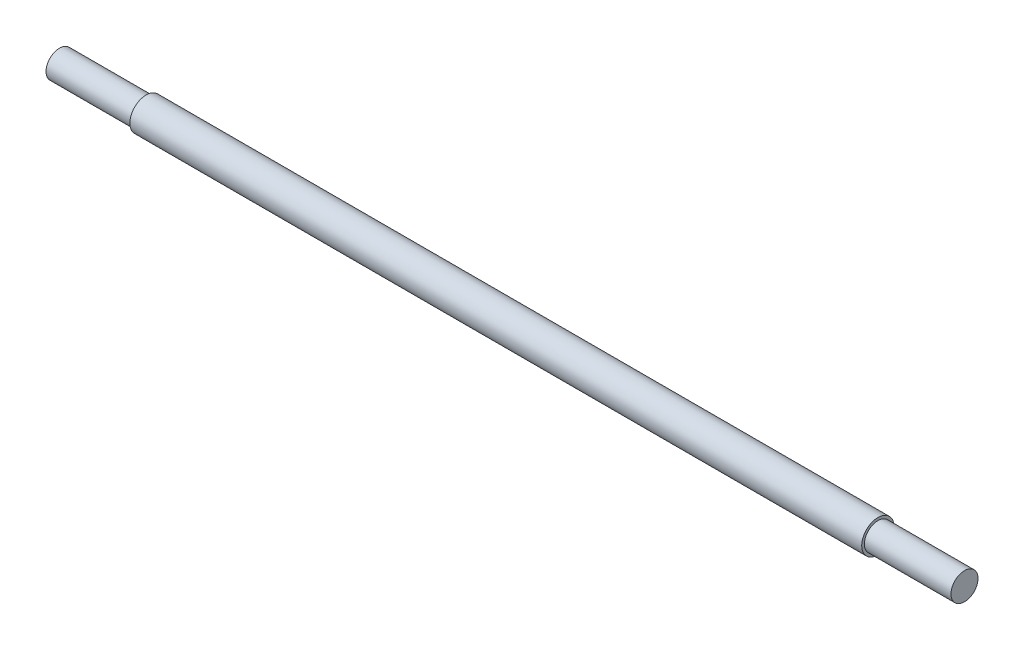
ISO-10303-21;
HEADER;
FILE_DESCRIPTION(('STEP AP214'),'2;1');
FILE_NAME('part.step','',(''),(''),'','','');
FILE_SCHEMA(('AUTOMOTIVE_DESIGN { 1 0 10303 214 1 1 1 1 }'));
ENDSEC;
DATA;
#1=APPLICATION_CONTEXT('core data for automotive mechanical design processes');
#2=APPLICATION_PROTOCOL_DEFINITION('international standard','automotive_design',2000,#1);
#3=PRODUCT_CONTEXT('',#1,'mechanical');
#4=PRODUCT('Part','Part','',(#3));
#5=PRODUCT_RELATED_PRODUCT_CATEGORY('part','',(#4));
#6=PRODUCT_DEFINITION_FORMATION('','',#4);
#7=PRODUCT_DEFINITION_CONTEXT('part definition',#1,'design');
#8=PRODUCT_DEFINITION('design','',#6,#7);
#9=PRODUCT_DEFINITION_SHAPE('','',#8);
#10=(LENGTH_UNIT() NAMED_UNIT(*) SI_UNIT(.MILLI.,.METRE.));
#11=(NAMED_UNIT(*) PLANE_ANGLE_UNIT() SI_UNIT($,.RADIAN.));
#12=(NAMED_UNIT(*) SI_UNIT($,.STERADIAN.) SOLID_ANGLE_UNIT());
#13=UNCERTAINTY_MEASURE_WITH_UNIT(LENGTH_MEASURE(1.E-05),#10,'distance_accuracy_value','');
#14=(GEOMETRIC_REPRESENTATION_CONTEXT(3) GLOBAL_UNCERTAINTY_ASSIGNED_CONTEXT((#13)) GLOBAL_UNIT_ASSIGNED_CONTEXT((#10,
#11,#12)) REPRESENTATION_CONTEXT('',''));
#15=CARTESIAN_POINT('',(0.,0.,0.));
#16=DIRECTION('',(0.,0.,1.));
#17=DIRECTION('',(1.,0.,0.));
#18=AXIS2_PLACEMENT_3D('',#15,#16,#17);
#19=CARTESIAN_POINT('',(0.,1.25000000000001,0.));
#20=DIRECTION('',(1.,0.,0.));
#21=DIRECTION('',(0.,0.,-1.));
#22=AXIS2_PLACEMENT_3D('',#19,#20,#21);
#23=PLANE('',#22);
#24=CARTESIAN_POINT('',(0.,0.,0.));
#25=DIRECTION('',(-1.,0.,0.));
#26=DIRECTION('',(0.,0.,1.));
#27=AXIS2_PLACEMENT_3D('',#24,#25,#26);
#28=CIRCLE('',#27,1.25000000000001);
#29=CARTESIAN_POINT('',(0.,0.,1.25000000000001));
#30=VERTEX_POINT('',#29);
#31=EDGE_CURVE('E53',#30,#30,#28,.T.);
#32=ORIENTED_EDGE('',*,*,#31,.T.);
#33=EDGE_LOOP('',(#32));
#34=FACE_BOUND('',#33,.T.);
#35=ADVANCED_FACE('F31',(#34),#23,.F.);
#36=CARTESIAN_POINT('',(83.63,0.,0.));
#37=DIRECTION('',(-1.,0.,0.));
#38=DIRECTION('',(0.,0.,1.));
#39=AXIS2_PLACEMENT_3D('',#36,#37,#38);
#40=PLANE('',#39);
#41=CARTESIAN_POINT('',(83.63,0.,0.));
#42=DIRECTION('',(-1.,0.,0.));
#43=DIRECTION('',(0.,0.,1.));
#44=AXIS2_PLACEMENT_3D('',#41,#42,#43);
#45=CIRCLE('',#44,1.25);
#46=CARTESIAN_POINT('',(83.63,0.,1.25));
#47=VERTEX_POINT('',#46);
#48=EDGE_CURVE('E10',#47,#47,#45,.T.);
#49=ORIENTED_EDGE('',*,*,#48,.F.);
#50=EDGE_LOOP('',(#49));
#51=FACE_BOUND('',#50,.T.);
#52=ADVANCED_FACE('F83',(#51),#40,.F.);
#53=CARTESIAN_POINT('',(0.,0.,0.));
#54=DIRECTION('',(-1.,0.,0.));
#55=DIRECTION('',(0.,0.,1.));
#56=AXIS2_PLACEMENT_3D('',#53,#54,#55);
#57=CYLINDRICAL_SURFACE('',#56,1.25);
#58=CARTESIAN_POINT('',(75.63,0.,0.));
#59=DIRECTION('',(-1.,0.,0.));
#60=DIRECTION('',(0.,0.,1.));
#61=AXIS2_PLACEMENT_3D('',#58,#59,#60);
#62=CIRCLE('',#61,1.25);
#63=CARTESIAN_POINT('',(75.63,0.,1.25));
#64=VERTEX_POINT('',#63);
#65=EDGE_CURVE('E37',#64,#64,#62,.T.);
#66=ORIENTED_EDGE('',*,*,#65,.F.);
#67=EDGE_LOOP('',(#66));
#68=FACE_BOUND('',#67,.T.);
#69=ORIENTED_EDGE('',*,*,#48,.T.);
#70=EDGE_LOOP('',(#69));
#71=FACE_BOUND('',#70,.T.);
#72=ADVANCED_FACE('F78',(#68,#71),#57,.T.);
#73=CARTESIAN_POINT('',(75.63,1.25,0.));
#74=DIRECTION('',(-1.,0.,0.));
#75=DIRECTION('',(0.,0.,1.));
#76=AXIS2_PLACEMENT_3D('',#73,#74,#75);
#77=PLANE('',#76);
#78=CARTESIAN_POINT('',(75.63,0.,0.));
#79=DIRECTION('',(-1.,0.,0.));
#80=DIRECTION('',(0.,0.,1.));
#81=AXIS2_PLACEMENT_3D('',#78,#79,#80);
#82=CIRCLE('',#81,1.5);
#83=CARTESIAN_POINT('',(75.63,0.,1.5));
#84=VERTEX_POINT('',#83);
#85=EDGE_CURVE('E41',#84,#84,#82,.T.);
#86=ORIENTED_EDGE('',*,*,#85,.F.);
#87=EDGE_LOOP('',(#86));
#88=FACE_BOUND('',#87,.T.);
#89=ORIENTED_EDGE('',*,*,#65,.T.);
#90=EDGE_LOOP('',(#89));
#91=FACE_BOUND('',#90,.T.);
#92=ADVANCED_FACE('F73',(#88,#91),#77,.F.);
#93=CARTESIAN_POINT('',(0.,0.,0.));
#94=DIRECTION('',(-1.,0.,0.));
#95=DIRECTION('',(0.,0.,1.));
#96=AXIS2_PLACEMENT_3D('',#93,#94,#95);
#97=CYLINDRICAL_SURFACE('',#96,1.5);
#98=CARTESIAN_POINT('',(8.,0.,0.));
#99=DIRECTION('',(-1.,0.,0.));
#100=DIRECTION('',(0.,0.,1.));
#101=AXIS2_PLACEMENT_3D('',#98,#99,#100);
#102=CIRCLE('',#101,1.49999999999999);
#103=CARTESIAN_POINT('',(8.,0.,1.49999999999999));
#104=VERTEX_POINT('',#103);
#105=EDGE_CURVE('E45',#104,#104,#102,.T.);
#106=ORIENTED_EDGE('',*,*,#105,.F.);
#107=EDGE_LOOP('',(#106));
#108=FACE_BOUND('',#107,.T.);
#109=ORIENTED_EDGE('',*,*,#85,.T.);
#110=EDGE_LOOP('',(#109));
#111=FACE_BOUND('',#110,.T.);
#112=ADVANCED_FACE('F67',(#108,#111),#97,.T.);
#113=CARTESIAN_POINT('',(8.,1.49999999999999,0.));
#114=DIRECTION('',(1.,0.,0.));
#115=DIRECTION('',(0.,0.,-1.));
#116=AXIS2_PLACEMENT_3D('',#113,#114,#115);
#117=PLANE('',#116);
#118=CARTESIAN_POINT('',(8.,0.,0.));
#119=DIRECTION('',(-1.,0.,0.));
#120=DIRECTION('',(0.,0.,1.));
#121=AXIS2_PLACEMENT_3D('',#118,#119,#120);
#122=CIRCLE('',#121,1.25000000000001);
#123=CARTESIAN_POINT('',(8.,0.,1.25000000000001));
#124=VERTEX_POINT('',#123);
#125=EDGE_CURVE('E50',#124,#124,#122,.T.);
#126=ORIENTED_EDGE('',*,*,#125,.F.);
#127=EDGE_LOOP('',(#126));
#128=FACE_BOUND('',#127,.T.);
#129=ORIENTED_EDGE('',*,*,#105,.T.);
#130=EDGE_LOOP('',(#129));
#131=FACE_BOUND('',#130,.T.);
#132=ADVANCED_FACE('F61',(#128,#131),#117,.F.);
#133=CARTESIAN_POINT('',(0.,0.,0.));
#134=DIRECTION('',(-1.,0.,0.));
#135=DIRECTION('',(0.,0.,1.));
#136=AXIS2_PLACEMENT_3D('',#133,#134,#135);
#137=CYLINDRICAL_SURFACE('',#136,1.25000000000001);
#138=ORIENTED_EDGE('',*,*,#31,.F.);
#139=EDGE_LOOP('',(#138));
#140=FACE_BOUND('',#139,.T.);
#141=ORIENTED_EDGE('',*,*,#125,.T.);
#142=EDGE_LOOP('',(#141));
#143=FACE_BOUND('',#142,.T.);
#144=ADVANCED_FACE('F58',(#140,#143),#137,.T.);
#145=CLOSED_SHELL('',(#35,#52,#72,#92,#112,#132,#144));
#146=MANIFOLD_SOLID_BREP('B2',#145);
#147=ADVANCED_BREP_SHAPE_REPRESENTATION('',(#18,#146),#14);
#148=SHAPE_DEFINITION_REPRESENTATION(#9,#147);
ENDSEC;
END-ISO-10303-21;
